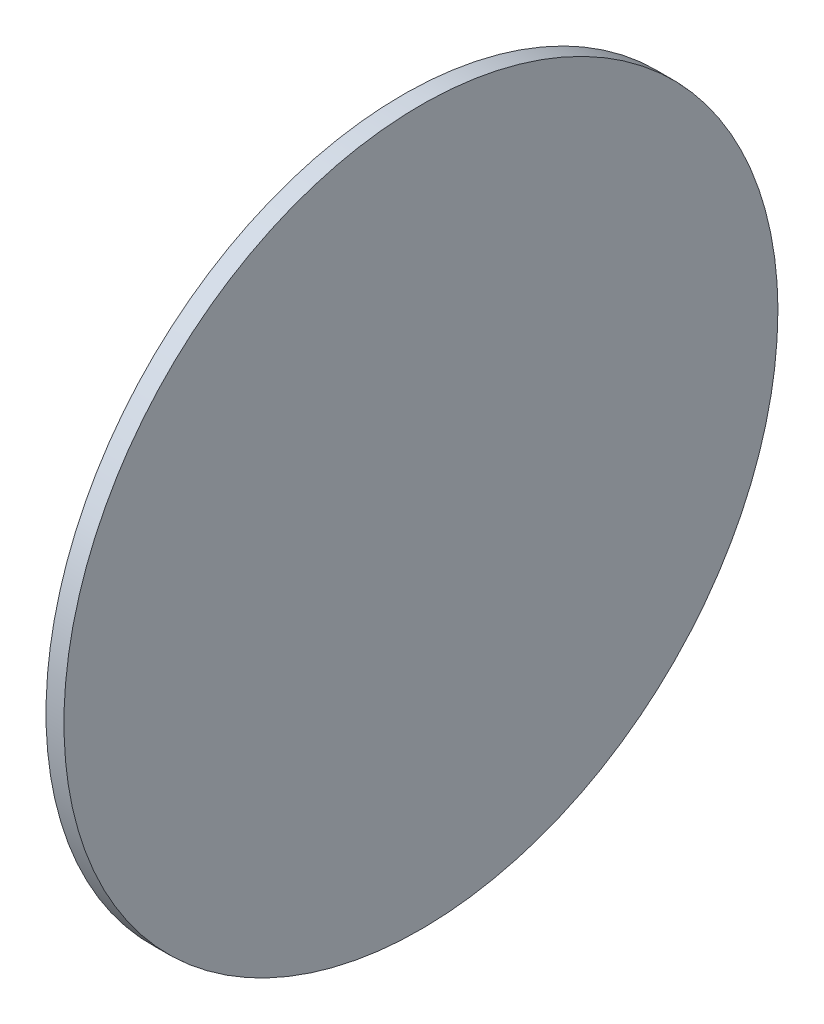
ISO-10303-21;
HEADER;
FILE_DESCRIPTION(('STEP AP214'),'2;1');
FILE_NAME('part.step','',(''),(''),'','','');
FILE_SCHEMA(('AUTOMOTIVE_DESIGN { 1 0 10303 214 1 1 1 1 }'));
ENDSEC;
DATA;
#1=APPLICATION_CONTEXT('core data for automotive mechanical design processes');
#2=APPLICATION_PROTOCOL_DEFINITION('international standard','automotive_design',2000,#1);
#3=PRODUCT_CONTEXT('',#1,'mechanical');
#4=PRODUCT('Part','Part','',(#3));
#5=PRODUCT_RELATED_PRODUCT_CATEGORY('part','',(#4));
#6=PRODUCT_DEFINITION_FORMATION('','',#4);
#7=PRODUCT_DEFINITION_CONTEXT('part definition',#1,'design');
#8=PRODUCT_DEFINITION('design','',#6,#7);
#9=PRODUCT_DEFINITION_SHAPE('','',#8);
#10=(LENGTH_UNIT() NAMED_UNIT(*) SI_UNIT(.MILLI.,.METRE.));
#11=(NAMED_UNIT(*) PLANE_ANGLE_UNIT() SI_UNIT($,.RADIAN.));
#12=(NAMED_UNIT(*) SI_UNIT($,.STERADIAN.) SOLID_ANGLE_UNIT());
#13=UNCERTAINTY_MEASURE_WITH_UNIT(LENGTH_MEASURE(1.E-05),#10,'distance_accuracy_value','');
#14=(GEOMETRIC_REPRESENTATION_CONTEXT(3) GLOBAL_UNCERTAINTY_ASSIGNED_CONTEXT((#13)) GLOBAL_UNIT_ASSIGNED_CONTEXT((#10,
#11,#12)) REPRESENTATION_CONTEXT('',''));
#15=CARTESIAN_POINT('',(0.,0.,0.));
#16=DIRECTION('',(0.,0.,1.));
#17=DIRECTION('',(1.,0.,0.));
#18=AXIS2_PLACEMENT_3D('',#15,#16,#17);
#19=CARTESIAN_POINT('',(453.240366113346,276.116733993281,-130.857064009928));
#20=CARTESIAN_POINT('',(453.240366113346,278.977027062807,-130.857064009928));
#21=CARTESIAN_POINT('',(453.240366113346,284.697613201859,-130.576029634082));
#22=CARTESIAN_POINT('',(453.240366113346,293.195853852873,-129.315434714775));
#23=CARTESIAN_POINT('',(453.240366113346,301.529613243243,-127.227936658116));
#24=CARTESIAN_POINT('',(453.240366113346,309.618632714343,-124.333639211531));
#25=CARTESIAN_POINT('',(453.240366113346,317.385010586758,-120.660416041617));
#26=CARTESIAN_POINT('',(453.240366113346,324.753952396043,-116.243642295488));
#27=CARTESIAN_POINT('',(453.240366113346,331.654491204301,-111.125853918771));
#28=CARTESIAN_POINT('',(453.240366113346,338.020171050591,-105.356338011204));
#29=CARTESIAN_POINT('',(453.240366113346,343.789686958158,-98.9906581649144));
#30=CARTESIAN_POINT('',(453.240366113346,348.907475334874,-92.090119356656));
#31=CARTESIAN_POINT('',(453.240366113346,353.324249081004,-84.7211775473709));
#32=CARTESIAN_POINT('',(453.240366113346,356.997472250918,-76.9547996749559));
#33=CARTESIAN_POINT('',(453.240366113346,359.891769697502,-68.8657802038563));
#34=CARTESIAN_POINT('',(453.240366113346,361.979267754162,-60.5320208134866));
#35=CARTESIAN_POINT('',(453.240366113346,363.239862673468,-52.0337801624725));
#36=CARTESIAN_POINT('',(453.240366113346,363.661414237238,-43.452900953894));
#37=CARTESIAN_POINT('',(453.240366113346,363.239862673468,-34.8720217453155));
#38=CARTESIAN_POINT('',(453.240366113346,361.979267754162,-26.3737810943013));
#39=CARTESIAN_POINT('',(453.240366113346,359.891769697502,-18.0400217039317));
#40=CARTESIAN_POINT('',(453.240366113346,356.997472250918,-9.951002232832));
#41=CARTESIAN_POINT('',(453.240366113346,353.324249081004,-2.18462436041703));
#42=CARTESIAN_POINT('',(453.240366113346,348.907475334874,5.1843174488681));
#43=CARTESIAN_POINT('',(453.240366113346,343.789686958158,12.0848562571265));
#44=CARTESIAN_POINT('',(453.240366113346,338.020171050591,18.4505361034164));
#45=CARTESIAN_POINT('',(453.240366113346,331.654491204301,24.2200520109835));
#46=CARTESIAN_POINT('',(453.240366113346,324.753952396043,29.3378403876997));
#47=CARTESIAN_POINT('',(453.240366113346,317.385010586758,33.7546141338295));
#48=CARTESIAN_POINT('',(453.240366113346,309.618632714343,37.4278373037436));
#49=CARTESIAN_POINT('',(453.240366113346,301.529613243243,40.3221347503276));
#50=CARTESIAN_POINT('',(453.240366113346,293.195853852873,42.4096328069871));
#51=CARTESIAN_POINT('',(453.240366113346,284.697613201859,43.6702277262938));
#52=CARTESIAN_POINT('',(453.240366113346,276.116733993281,44.0917792900636));
#53=CARTESIAN_POINT('',(453.240366113346,267.535854784702,43.6702277262938));
#54=CARTESIAN_POINT('',(453.240366113346,259.037614133688,42.4096328069871));
#55=CARTESIAN_POINT('',(453.240366113346,250.703854743318,40.3221347503276));
#56=CARTESIAN_POINT('',(453.240366113346,242.614835272219,37.4278373037436));
#57=CARTESIAN_POINT('',(453.240366113346,234.848457399804,33.7546141338295));
#58=CARTESIAN_POINT('',(453.240366113346,227.479515590519,29.3378403876997));
#59=CARTESIAN_POINT('',(453.240366113346,220.57897678226,24.2200520109835));
#60=CARTESIAN_POINT('',(453.240366113346,214.21329693597,18.4505361034164));
#61=CARTESIAN_POINT('',(453.240366113346,208.443781028403,12.0848562571265));
#62=CARTESIAN_POINT('',(453.240366113346,203.325992651687,5.18431744886809));
#63=CARTESIAN_POINT('',(453.240366113346,198.909218905557,-2.18462436041694));
#64=CARTESIAN_POINT('',(453.240366113346,195.235995735643,-9.95100223283197));
#65=CARTESIAN_POINT('',(453.240366113346,192.341698289059,-18.0400217039316));
#66=CARTESIAN_POINT('',(453.240366113346,190.2542002324,-26.3737810943013));
#67=CARTESIAN_POINT('',(453.240366113346,188.993605313093,-34.8720217453154));
#68=CARTESIAN_POINT('',(453.240366113346,188.572053749323,-43.452900953894));
#69=CARTESIAN_POINT('',(453.240366113346,188.993605313093,-52.0337801624724));
#70=CARTESIAN_POINT('',(453.240366113346,190.2542002324,-60.5320208134866));
#71=CARTESIAN_POINT('',(453.240366113346,192.341698289059,-68.8657802038562));
#72=CARTESIAN_POINT('',(453.240366113346,195.235995735643,-76.9547996749559));
#73=CARTESIAN_POINT('',(453.240366113346,198.909218905557,-84.7211775473709));
#74=CARTESIAN_POINT('',(453.240366113346,203.325992651687,-92.090119356656));
#75=CARTESIAN_POINT('',(453.240366113346,208.443781028403,-98.9906581649144));
#76=CARTESIAN_POINT('',(453.240366113346,214.21329693597,-105.356338011204));
#77=CARTESIAN_POINT('',(453.240366113346,220.57897678226,-111.125853918771));
#78=CARTESIAN_POINT('',(453.240366113346,227.479515590519,-116.243642295488));
#79=CARTESIAN_POINT('',(453.240366113346,234.848457399804,-120.660416041617));
#80=CARTESIAN_POINT('',(453.240366113346,242.614835272219,-124.333639211531));
#81=CARTESIAN_POINT('',(453.240366113346,250.703854743318,-127.227936658116));
#82=CARTESIAN_POINT('',(453.240366113346,259.037614133688,-129.315434714775));
#83=CARTESIAN_POINT('',(453.240366113346,267.535854784702,-130.576029634082));
#84=CARTESIAN_POINT('',(453.240366113346,273.256440923754,-130.857064009928));
#85=CARTESIAN_POINT('',(453.240366113346,276.116733993281,-130.857064009928));
#86=B_SPLINE_CURVE_WITH_KNOTS('',3,(#19,#20,#21,#22,#23,#24,#25,#26,#27,#28,#29,#30,#31,#32,#33,
#34,#35,#36,#37,#38,#39,#40,#41,#42,#43,#44,#45,#46,#47,#48,#49,#50,#51,#52,#53,#54,#55,#56,#57,
#58,#59,#60,#61,#62,#63,#64,#65,#66,#67,#68,#69,#70,#71,#72,#73,#74,#75,#76,#77,#78,#79,#80,#81,
#82,#83,#84,#85),.UNSPECIFIED.,.T.,.F.,(4,1,1,1,1,1,1,1,1,1,1,1,1,1,1,1,1,1,1,1,1,1,1,1,1,1,1,1,
1,1,1,1,1,1,1,1,1,1,1,1,1,1,1,1,1,1,1,1,1,1,1,1,1,1,1,1,1,1,1,1,1,1,1,1,4),(0.,0.015625,
0.0312499999999999,0.046875,0.0625,0.0781249999999999,0.0937499999999999,0.109375,0.125,
0.140625,0.15625,0.171875,0.1875,0.203125,0.21875,0.234375,0.25,0.265625,0.28125,0.296875,
0.3125,0.328125,0.34375,0.359375,0.375,0.390625,0.40625,0.421875,0.4375,0.453125,0.46875,
0.484375,0.5,0.515625,0.53125,0.546875,0.5625,0.578125,0.59375,0.609375,0.625,0.640625,0.65625,
0.671875,0.6875,0.703125,0.71875,0.734375,0.75,0.765625,0.78125,0.796875,0.8125,0.828125,
0.84375,0.859375,0.875,0.890625,0.90625,0.921875,0.9375,0.953125,0.96875,0.984375,1.),.UNSPECIFIED.);
#87=DIRECTION('',(1.,0.,0.));
#88=VECTOR('',#87,1.);
#89=SURFACE_OF_LINEAR_EXTRUSION('',#86,#88);
#90=CARTESIAN_POINT('',(453.240366113346,276.116733993281,-130.857064009928));
#91=CARTESIAN_POINT('',(453.240366113346,278.977027062807,-130.857064009928));
#92=CARTESIAN_POINT('',(453.240366113346,284.697613201859,-130.576029634082));
#93=CARTESIAN_POINT('',(453.240366113346,293.195853852873,-129.315434714775));
#94=CARTESIAN_POINT('',(453.240366113346,301.529613243243,-127.227936658116));
#95=CARTESIAN_POINT('',(453.240366113346,309.618632714343,-124.333639211531));
#96=CARTESIAN_POINT('',(453.240366113346,317.385010586758,-120.660416041617));
#97=CARTESIAN_POINT('',(453.240366113346,324.753952396043,-116.243642295488));
#98=CARTESIAN_POINT('',(453.240366113346,331.654491204301,-111.125853918771));
#99=CARTESIAN_POINT('',(453.240366113346,338.020171050591,-105.356338011204));
#100=CARTESIAN_POINT('',(453.240366113346,343.789686958158,-98.9906581649144));
#101=CARTESIAN_POINT('',(453.240366113346,348.907475334874,-92.090119356656));
#102=CARTESIAN_POINT('',(453.240366113346,353.324249081004,-84.7211775473709));
#103=CARTESIAN_POINT('',(453.240366113346,356.997472250918,-76.9547996749559));
#104=CARTESIAN_POINT('',(453.240366113346,359.891769697502,-68.8657802038563));
#105=CARTESIAN_POINT('',(453.240366113346,361.979267754162,-60.5320208134866));
#106=CARTESIAN_POINT('',(453.240366113346,363.239862673468,-52.0337801624725));
#107=CARTESIAN_POINT('',(453.240366113346,363.661414237238,-43.452900953894));
#108=CARTESIAN_POINT('',(453.240366113346,363.239862673468,-34.8720217453155));
#109=CARTESIAN_POINT('',(453.240366113346,361.979267754162,-26.3737810943013));
#110=CARTESIAN_POINT('',(453.240366113346,359.891769697502,-18.0400217039317));
#111=CARTESIAN_POINT('',(453.240366113346,356.997472250918,-9.951002232832));
#112=CARTESIAN_POINT('',(453.240366113346,353.324249081004,-2.18462436041703));
#113=CARTESIAN_POINT('',(453.240366113346,348.907475334874,5.1843174488681));
#114=CARTESIAN_POINT('',(453.240366113346,343.789686958158,12.0848562571265));
#115=CARTESIAN_POINT('',(453.240366113346,338.020171050591,18.4505361034164));
#116=CARTESIAN_POINT('',(453.240366113346,331.654491204301,24.2200520109835));
#117=CARTESIAN_POINT('',(453.240366113346,324.753952396043,29.3378403876997));
#118=CARTESIAN_POINT('',(453.240366113346,317.385010586758,33.7546141338295));
#119=CARTESIAN_POINT('',(453.240366113346,309.618632714343,37.4278373037436));
#120=CARTESIAN_POINT('',(453.240366113346,301.529613243243,40.3221347503276));
#121=CARTESIAN_POINT('',(453.240366113346,293.195853852873,42.4096328069871));
#122=CARTESIAN_POINT('',(453.240366113346,284.697613201859,43.6702277262938));
#123=CARTESIAN_POINT('',(453.240366113346,276.116733993281,44.0917792900636));
#124=CARTESIAN_POINT('',(453.240366113346,267.535854784702,43.6702277262938));
#125=CARTESIAN_POINT('',(453.240366113346,259.037614133688,42.4096328069871));
#126=CARTESIAN_POINT('',(453.240366113346,250.703854743318,40.3221347503276));
#127=CARTESIAN_POINT('',(453.240366113346,242.614835272219,37.4278373037436));
#128=CARTESIAN_POINT('',(453.240366113346,234.848457399804,33.7546141338295));
#129=CARTESIAN_POINT('',(453.240366113346,227.479515590519,29.3378403876997));
#130=CARTESIAN_POINT('',(453.240366113346,220.57897678226,24.2200520109835));
#131=CARTESIAN_POINT('',(453.240366113346,214.21329693597,18.4505361034164));
#132=CARTESIAN_POINT('',(453.240366113346,208.443781028403,12.0848562571265));
#133=CARTESIAN_POINT('',(453.240366113346,203.325992651687,5.18431744886809));
#134=CARTESIAN_POINT('',(453.240366113346,198.909218905557,-2.18462436041694));
#135=CARTESIAN_POINT('',(453.240366113346,195.235995735643,-9.95100223283197));
#136=CARTESIAN_POINT('',(453.240366113346,192.341698289059,-18.0400217039316));
#137=CARTESIAN_POINT('',(453.240366113346,190.2542002324,-26.3737810943013));
#138=CARTESIAN_POINT('',(453.240366113346,188.993605313093,-34.8720217453154));
#139=CARTESIAN_POINT('',(453.240366113346,188.572053749323,-43.452900953894));
#140=CARTESIAN_POINT('',(453.240366113346,188.993605313093,-52.0337801624724));
#141=CARTESIAN_POINT('',(453.240366113346,190.2542002324,-60.5320208134866));
#142=CARTESIAN_POINT('',(453.240366113346,192.341698289059,-68.8657802038562));
#143=CARTESIAN_POINT('',(453.240366113346,195.235995735643,-76.9547996749559));
#144=CARTESIAN_POINT('',(453.240366113346,198.909218905557,-84.7211775473709));
#145=CARTESIAN_POINT('',(453.240366113346,203.325992651687,-92.090119356656));
#146=CARTESIAN_POINT('',(453.240366113346,208.443781028403,-98.9906581649144));
#147=CARTESIAN_POINT('',(453.240366113346,214.21329693597,-105.356338011204));
#148=CARTESIAN_POINT('',(453.240366113346,220.57897678226,-111.125853918771));
#149=CARTESIAN_POINT('',(453.240366113346,227.479515590519,-116.243642295488));
#150=CARTESIAN_POINT('',(453.240366113346,234.848457399804,-120.660416041617));
#151=CARTESIAN_POINT('',(453.240366113346,242.614835272219,-124.333639211531));
#152=CARTESIAN_POINT('',(453.240366113346,250.703854743318,-127.227936658116));
#153=CARTESIAN_POINT('',(453.240366113346,259.037614133688,-129.315434714775));
#154=CARTESIAN_POINT('',(453.240366113346,267.535854784702,-130.576029634082));
#155=CARTESIAN_POINT('',(453.240366113346,273.256440923754,-130.857064009928));
#156=CARTESIAN_POINT('',(453.240366113346,276.116733993281,-130.857064009928));
#157=B_SPLINE_CURVE_WITH_KNOTS('',3,(#90,#91,#92,#93,#94,#95,#96,#97,#98,#99,#100,#101,#102,
#103,#104,#105,#106,#107,#108,#109,#110,#111,#112,#113,#114,#115,#116,#117,#118,#119,#120,#121,
#122,#123,#124,#125,#126,#127,#128,#129,#130,#131,#132,#133,#134,#135,#136,#137,#138,#139,#140,
#141,#142,#143,#144,#145,#146,#147,#148,#149,#150,#151,#152,#153,#154,#155,#156),.UNSPECIFIED.,
.T.,.F.,(4,1,1,1,1,1,1,1,1,1,1,1,1,1,1,1,1,1,1,1,1,1,1,1,1,1,1,1,1,1,1,1,1,1,1,1,1,1,1,1,1,1,1,
1,1,1,1,1,1,1,1,1,1,1,1,1,1,1,1,1,1,1,1,1,4),(0.,0.015625,0.0312499999999999,0.046875,0.0625,
0.0781249999999999,0.0937499999999999,0.109375,0.125,0.140625,0.15625,0.171875,0.1875,0.203125,
0.21875,0.234375,0.25,0.265625,0.28125,0.296875,0.3125,0.328125,0.34375,0.359375,0.375,0.390625,
0.40625,0.421875,0.4375,0.453125,0.46875,0.484375,0.5,0.515625,0.53125,0.546875,0.5625,0.578125,
0.59375,0.609375,0.625,0.640625,0.65625,0.671875,0.6875,0.703125,0.71875,0.734375,0.75,0.765625,
0.78125,0.796875,0.8125,0.828125,0.84375,0.859375,0.875,0.890625,0.90625,0.921875,0.9375,
0.953125,0.96875,0.984375,1.),.UNSPECIFIED.);
#158=CARTESIAN_POINT('',(453.240366113346,276.116733993281,-130.857064009928));
#159=VERTEX_POINT('',#158);
#160=EDGE_CURVE('E9',#159,#159,#157,.T.);
#161=ORIENTED_EDGE('',*,*,#160,.T.);
#162=EDGE_LOOP('',(#161));
#163=FACE_BOUND('',#162,.T.);
#164=CARTESIAN_POINT('',(457.634741800947,276.116733993281,-130.857064009928));
#165=CARTESIAN_POINT('',(457.634741800947,274.686587458518,-130.857064009928));
#166=CARTESIAN_POINT('',(457.634741800947,273.256440923754,-130.821934712947));
#167=CARTESIAN_POINT('',(457.634741800947,270.39959112746,-130.681586682191));
#168=CARTESIAN_POINT('',(457.634741800947,268.972887865929,-130.576367948415));
#169=CARTESIAN_POINT('',(457.634741800947,266.12636788933,-130.296010201236));
#170=CARTESIAN_POINT('',(457.634741800947,264.706551174263,-130.120871187832));
#171=CARTESIAN_POINT('',(457.634741800947,261.87721440322,-129.701178723821));
#172=CARTESIAN_POINT('',(457.634741800947,260.467694347244,-129.456625273213));
#173=CARTESIAN_POINT('',(457.634741800947,257.662361007013,-128.898609777219));
#174=CARTESIAN_POINT('',(457.634741800947,256.266547722758,-128.585147731832));
#175=CARTESIAN_POINT('',(457.634741800947,253.491972036744,-127.890152702422));
#176=CARTESIAN_POINT('',(457.634741800947,252.113209634986,-127.508619718398));
#177=CARTESIAN_POINT('',(457.634741800947,249.376079824741,-126.678320467858));
#178=CARTESIAN_POINT('',(457.634741800947,248.017712416255,-126.229554201341));
#179=CARTESIAN_POINT('',(457.634741800947,245.324618495864,-125.265949788587));
#180=CARTESIAN_POINT('',(457.634741800947,243.989891983959,-124.751111642351));
#181=CARTESIAN_POINT('',(457.634741800947,241.34732576004,-123.656524872935));
#182=CARTESIAN_POINT('',(457.634741800947,240.039486048026,-123.076776249755));
#183=CARTESIAN_POINT('',(457.634741800947,237.453809859906,-121.853842490913));
#184=CARTESIAN_POINT('',(457.634741800947,236.1759733838,-121.210657355252));
#185=CARTESIAN_POINT('',(457.634741800947,233.653420103517,-119.862324535911));
#186=CARTESIAN_POINT('',(457.634741800947,232.408703299339,-119.157176852232));
#187=CARTESIAN_POINT('',(457.634741800947,229.955346318656,-117.686691267923));
#188=CARTESIAN_POINT('',(457.634741800947,228.746706142152,-116.921353367294));
#189=CARTESIAN_POINT('',(457.634741800947,226.368459372561,-115.332259680153));
#190=CARTESIAN_POINT('',(457.634741800947,225.198852779475,-114.508503893641));
#191=CARTESIAN_POINT('',(457.634741800947,222.901442175095,-112.804628063891));
#192=CARTESIAN_POINT('',(457.634741800947,221.773638163801,-111.924508020653));
#193=CARTESIAN_POINT('',(457.634741800947,219.562601721376,-110.109957306606));
#194=CARTESIAN_POINT('',(457.634741800947,218.479369290246,-109.175526635797));
#195=CARTESIAN_POINT('',(457.634741800947,216.36003038218,-107.25466981628));
#196=CARTESIAN_POINT('',(457.634741800947,215.323923905246,-106.268243667572));
#197=CARTESIAN_POINT('',(457.634741800947,213.301391279603,-104.245711041929));
#198=CARTESIAN_POINT('',(457.634741800947,212.314965130895,-103.209604564994));
#199=CARTESIAN_POINT('',(457.634741800947,210.394108311378,-101.090265656929));
#200=CARTESIAN_POINT('',(457.634741800947,209.459677640569,-100.007033225799));
#201=CARTESIAN_POINT('',(457.634741800947,207.645126926521,-97.795996783374));
#202=CARTESIAN_POINT('',(457.634741800947,206.765006883283,-96.6681927720796));
#203=CARTESIAN_POINT('',(457.634741800947,205.061131053534,-94.3707821676994));
#204=CARTESIAN_POINT('',(457.634741800947,204.237375267022,-93.2011755746136));
#205=CARTESIAN_POINT('',(457.634741800947,202.648281579881,-90.822928805023));
#206=CARTESIAN_POINT('',(457.634741800947,201.882943679252,-89.6142886285182));
#207=CARTESIAN_POINT('',(457.634741800947,200.412458094943,-87.1609316478356));
#208=CARTESIAN_POINT('',(457.634741800947,199.707310411264,-85.9162148436576));
#209=CARTESIAN_POINT('',(457.634741800947,198.358977591923,-83.3936615633743));
#210=CARTESIAN_POINT('',(457.634741800947,197.715792456262,-82.1158250872689));
#211=CARTESIAN_POINT('',(457.634741800947,196.49285869742,-79.5301488991491));
#212=CARTESIAN_POINT('',(457.634741800947,195.91311007424,-78.2223091871347));
#213=CARTESIAN_POINT('',(457.634741800947,194.818523304823,-75.5797429632156));
#214=CARTESIAN_POINT('',(457.634741800947,194.303685158587,-74.2450164513109));
#215=CARTESIAN_POINT('',(457.634741800947,193.340080745834,-71.5519225309199));
#216=CARTESIAN_POINT('',(457.634741800947,192.891314479317,-70.1935551224338));
#217=CARTESIAN_POINT('',(457.634741800947,192.061015228776,-67.4564253121889));
#218=CARTESIAN_POINT('',(457.634741800947,191.679482244753,-66.0776629104302));
#219=CARTESIAN_POINT('',(457.634741800947,190.984487215343,-63.3030872244164));
#220=CARTESIAN_POINT('',(457.634741800947,190.671025169956,-61.9072739401612));
#221=CARTESIAN_POINT('',(457.634741800947,190.113009673961,-59.1019405999306));
#222=CARTESIAN_POINT('',(457.634741800947,189.868456223354,-57.6924205439551));
#223=CARTESIAN_POINT('',(457.634741800947,189.448763759343,-54.8630837729121));
#224=CARTESIAN_POINT('',(457.634741800947,189.273624745939,-53.4432670578445));
#225=CARTESIAN_POINT('',(457.634741800947,188.993266998759,-50.5967470812458));
#226=CARTESIAN_POINT('',(457.634741800947,188.888048264984,-49.1700438197145));
#227=CARTESIAN_POINT('',(457.634741800947,188.747700234227,-46.3131940234202));
#228=CARTESIAN_POINT('',(457.634741800947,188.712570937246,-44.8830474886571));
#229=CARTESIAN_POINT('',(457.634741800947,188.712570937246,-42.022754419131));
#230=CARTESIAN_POINT('',(457.634741800947,188.747700234227,-40.5926078843679));
#231=CARTESIAN_POINT('',(457.634741800947,188.888048264984,-37.7357580880736));
#232=CARTESIAN_POINT('',(457.634741800947,188.993266998759,-36.3090548265423));
#233=CARTESIAN_POINT('',(457.634741800947,189.273624745939,-33.4625348499435));
#234=CARTESIAN_POINT('',(457.634741800947,189.448763759343,-32.042718134876));
#235=CARTESIAN_POINT('',(457.634741800947,189.868456223354,-29.2133813638329));
#236=CARTESIAN_POINT('',(457.634741800947,190.113009673961,-27.8038613078574));
#237=CARTESIAN_POINT('',(457.634741800947,190.671025169956,-24.9985279676268));
#238=CARTESIAN_POINT('',(457.634741800947,190.984487215343,-23.6027146833717));
#239=CARTESIAN_POINT('',(457.634741800947,191.679482244753,-20.8281389973579));
#240=CARTESIAN_POINT('',(457.634741800947,192.061015228776,-19.4493765955992));
#241=CARTESIAN_POINT('',(457.634741800947,192.891314479317,-16.7122467853543));
#242=CARTESIAN_POINT('',(457.634741800947,193.340080745834,-15.3538793768681));
#243=CARTESIAN_POINT('',(457.634741800947,194.303685158587,-12.6607854564772));
#244=CARTESIAN_POINT('',(457.634741800947,194.818523304823,-11.3260589445724));
#245=CARTESIAN_POINT('',(457.634741800947,195.91311007424,-8.68349272065329));
#246=CARTESIAN_POINT('',(457.634741800947,196.49285869742,-7.37565300863891));
#247=CARTESIAN_POINT('',(457.634741800947,197.715792456261,-4.78997682051912));
#248=CARTESIAN_POINT('',(457.634741800947,198.358977591923,-3.51214034441369));
#249=CARTESIAN_POINT('',(457.634741800947,199.707310411264,-0.989587064130344));
#250=CARTESIAN_POINT('',(457.634741800947,200.412458094943,0.255129740047586));
#251=CARTESIAN_POINT('',(457.634741800947,201.882943679251,2.70848672073024));
#252=CARTESIAN_POINT('',(457.634741800947,202.648281579881,3.91712689723497));
#253=CARTESIAN_POINT('',(457.634741800947,204.237375267022,6.29537366682554));
#254=CARTESIAN_POINT('',(457.634741800947,205.061131053534,7.46498025991138));
#255=CARTESIAN_POINT('',(457.634741800947,206.765006883283,9.7623908642916));
#256=CARTESIAN_POINT('',(457.634741800947,207.645126926521,10.890194875586));
#257=CARTESIAN_POINT('',(457.634741800947,209.459677640569,13.1012313180107));
#258=CARTESIAN_POINT('',(457.634741800947,210.394108311378,14.184463749141));
#259=CARTESIAN_POINT('',(457.634741800947,212.314965130895,16.3038026572062));
#260=CARTESIAN_POINT('',(457.634741800947,213.301391279603,17.3399091341411));
#261=CARTESIAN_POINT('',(457.634741800947,215.323923905245,19.3624417597839));
#262=CARTESIAN_POINT('',(457.634741800948,216.36003038218,20.3488679084919));
#263=CARTESIAN_POINT('',(457.634741800948,218.479369290246,22.2697247280089));
#264=CARTESIAN_POINT('',(457.634741800948,219.562601721376,23.204155398818));
#265=CARTESIAN_POINT('',(457.634741800948,221.773638163801,25.0187061128652));
#266=CARTESIAN_POINT('',(457.634741800948,222.901442175095,25.8988261561034));
#267=CARTESIAN_POINT('',(457.634741800948,225.198852779475,27.6027019858531));
#268=CARTESIAN_POINT('',(457.634741800947,226.368459372561,28.4264577723648));
#269=CARTESIAN_POINT('',(457.634741800947,228.746706142152,30.0155514595058));
#270=CARTESIAN_POINT('',(457.634741800948,229.955346318656,30.7808893601352));
#271=CARTESIAN_POINT('',(457.634741800948,232.408703299339,32.2513749444439));
#272=CARTESIAN_POINT('',(457.634741800947,233.653420103517,32.9565226281232));
#273=CARTESIAN_POINT('',(457.634741800947,236.1759733838,34.3048554474638));
#274=CARTESIAN_POINT('',(457.634741800948,237.453809859906,34.9480405831252));
#275=CARTESIAN_POINT('',(457.634741800948,240.039486048026,36.1709743419668));
#276=CARTESIAN_POINT('',(457.634741800948,241.34732576004,36.750722965147));
#277=CARTESIAN_POINT('',(457.634741800947,243.989891983959,37.8453097345634));
#278=CARTESIAN_POINT('',(457.634741800947,245.324618495864,38.3601478807995));
#279=CARTESIAN_POINT('',(457.634741800947,248.017712416255,39.3237522935527));
#280=CARTESIAN_POINT('',(457.634741800947,249.376079824741,39.7725185600699));
#281=CARTESIAN_POINT('',(457.634741800947,252.113209634986,40.6028178106105));
#282=CARTESIAN_POINT('',(457.634741800947,253.491972036744,40.9843507946339));
#283=CARTESIAN_POINT('',(457.634741800947,256.266547722758,41.6793458240442));
#284=CARTESIAN_POINT('',(457.634741800947,257.662361007013,41.9928078694311));
#285=CARTESIAN_POINT('',(457.634741800947,260.467694347244,42.5508233654255));
#286=CARTESIAN_POINT('',(457.634741800947,261.877214403219,42.7953768160329));
#287=CARTESIAN_POINT('',(457.634741800947,264.706551174262,43.2150692800442));
#288=CARTESIAN_POINT('',(457.634741800947,266.12636788933,43.3902082934479));
#289=CARTESIAN_POINT('',(457.634741800947,268.972887865929,43.6705660406273));
#290=CARTESIAN_POINT('',(457.634741800947,270.39959112746,43.775784774403));
#291=CARTESIAN_POINT('',(457.634741800947,273.256440923754,43.9161328051595));
#292=CARTESIAN_POINT('',(457.634741800947,274.686587458517,43.9512621021403));
#293=CARTESIAN_POINT('',(457.634741800947,277.546880528044,43.9512621021403));
#294=CARTESIAN_POINT('',(457.634741800947,278.977027062807,43.9161328051595));
#295=CARTESIAN_POINT('',(457.634741800947,281.833876859101,43.775784774403));
#296=CARTESIAN_POINT('',(457.634741800948,283.260580120632,43.6705660406274));
#297=CARTESIAN_POINT('',(457.634741800948,286.107100097231,43.390208293448));
#298=CARTESIAN_POINT('',(457.634741800948,287.526916812299,43.2150692800442));
#299=CARTESIAN_POINT('',(457.634741800947,290.356253583342,42.795376816033));
#300=CARTESIAN_POINT('',(457.634741800947,291.765773639317,42.5508233654255));
#301=CARTESIAN_POINT('',(457.634741800947,294.571106979548,41.9928078694312));
#302=CARTESIAN_POINT('',(457.634741800947,295.966920263803,41.6793458240443));
#303=CARTESIAN_POINT('',(457.634741800947,298.741495949817,40.984350794634));
#304=CARTESIAN_POINT('',(457.634741800947,300.120258351575,40.6028178106105));
#305=CARTESIAN_POINT('',(457.634741800947,302.85738816182,39.77251856007));
#306=CARTESIAN_POINT('',(457.634741800947,304.215755570306,39.3237522935528));
#307=CARTESIAN_POINT('',(457.634741800947,306.908849490697,38.3601478807996));
#308=CARTESIAN_POINT('',(457.634741800947,308.243576002602,37.8453097345635));
#309=CARTESIAN_POINT('',(457.634741800947,310.886142226521,36.7507229651471));
#310=CARTESIAN_POINT('',(457.634741800947,312.193981938536,36.1709743419669));
#311=CARTESIAN_POINT('',(457.634741800947,314.779658126655,34.9480405831253));
#312=CARTESIAN_POINT('',(457.634741800947,316.057494602761,34.304855447464));
#313=CARTESIAN_POINT('',(457.634741800947,318.580047883044,32.9565226281233));
#314=CARTESIAN_POINT('',(457.634741800947,319.824764687222,32.251374944444));
#315=CARTESIAN_POINT('',(457.634741800947,322.278121667905,30.7808893601353));
#316=CARTESIAN_POINT('',(457.634741800947,323.48676184441,30.0155514595059));
#317=CARTESIAN_POINT('',(457.634741800947,325.865008614,28.4264577723649));
#318=CARTESIAN_POINT('',(457.634741800947,327.034615207086,27.6027019858533));
#319=CARTESIAN_POINT('',(457.634741800947,329.332025811466,25.8988261561035));
#320=CARTESIAN_POINT('',(457.634741800947,330.459829822761,25.0187061128653));
#321=CARTESIAN_POINT('',(457.634741800947,332.670866265185,23.2041553988181));
#322=CARTESIAN_POINT('',(457.634741800947,333.754098696316,22.2697247280091));
#323=CARTESIAN_POINT('',(457.634741800947,335.873437604381,20.3488679084921));
#324=CARTESIAN_POINT('',(457.634741800947,336.909544081316,19.3624417597841));
#325=CARTESIAN_POINT('',(457.634741800947,338.932076706959,17.3399091341412));
#326=CARTESIAN_POINT('',(457.634741800947,339.918502855666,16.3038026572064));
#327=CARTESIAN_POINT('',(457.634741800947,341.839359675184,14.1844637491412));
#328=CARTESIAN_POINT('',(457.634741800947,342.773790345993,13.1012313180108));
#329=CARTESIAN_POINT('',(457.634741800947,344.58834106004,10.8901948755861));
#330=CARTESIAN_POINT('',(457.634741800947,345.468461103278,9.76239086429173));
#331=CARTESIAN_POINT('',(457.634741800947,347.172336933028,7.46498025991151));
#332=CARTESIAN_POINT('',(457.634741800947,347.996092719539,6.29537366682568));
#333=CARTESIAN_POINT('',(457.634741800947,349.585186406681,3.91712689723511));
#334=CARTESIAN_POINT('',(457.634741800947,350.35052430731,2.70848672073036));
#335=CARTESIAN_POINT('',(457.634741800947,351.821009891619,0.255129740047687));
#336=CARTESIAN_POINT('',(457.634741800948,352.526157575298,-0.989587064130239));
#337=CARTESIAN_POINT('',(457.634741800948,353.874490394639,-3.51214034441359));
#338=CARTESIAN_POINT('',(457.634741800948,354.5176755303,-4.78997682051902));
#339=CARTESIAN_POINT('',(457.634741800948,355.740609289141,-7.37565300863881));
#340=CARTESIAN_POINT('',(457.634741800947,356.320357912322,-8.68349272065316));
#341=CARTESIAN_POINT('',(457.634741800947,357.414944681738,-11.3260589445723));
#342=CARTESIAN_POINT('',(457.634741800947,357.929782827974,-12.660785456477));
#343=CARTESIAN_POINT('',(457.634741800947,358.893387240727,-15.3538793768679));
#344=CARTESIAN_POINT('',(457.634741800947,359.342153507245,-16.7122467853541));
#345=CARTESIAN_POINT('',(457.634741800947,360.172452757785,-19.449376595599));
#346=CARTESIAN_POINT('',(457.634741800947,360.553985741809,-20.8281389973577));
#347=CARTESIAN_POINT('',(457.634741800947,361.248980771219,-23.6027146833715));
#348=CARTESIAN_POINT('',(457.634741800947,361.562442816606,-24.9985279676267));
#349=CARTESIAN_POINT('',(457.634741800947,362.1204583126,-27.8038613078573));
#350=CARTESIAN_POINT('',(457.634741800947,362.365011763208,-29.2133813638328));
#351=CARTESIAN_POINT('',(457.634741800947,362.784704227219,-32.0427181348759));
#352=CARTESIAN_POINT('',(457.634741800947,362.959843240623,-33.4625348499434));
#353=CARTESIAN_POINT('',(457.634741800947,363.240200987802,-36.3090548265422));
#354=CARTESIAN_POINT('',(457.634741800947,363.345419721578,-37.7357580880734));
#355=CARTESIAN_POINT('',(457.634741800947,363.485767752334,-40.5926078843677));
#356=CARTESIAN_POINT('',(457.634741800947,363.520897049315,-42.0227544191308));
#357=CARTESIAN_POINT('',(457.634741800947,363.520897049315,-44.883047488657));
#358=CARTESIAN_POINT('',(457.634741800947,363.485767752334,-46.3131940234201));
#359=CARTESIAN_POINT('',(457.634741800948,363.345419721578,-49.1700438197144));
#360=CARTESIAN_POINT('',(457.634741800948,363.240200987802,-50.5967470812456));
#361=CARTESIAN_POINT('',(457.634741800948,362.959843240623,-53.4432670578444));
#362=CARTESIAN_POINT('',(457.634741800948,362.784704227219,-54.8630837729119));
#363=CARTESIAN_POINT('',(457.634741800948,362.365011763208,-57.692420543955));
#364=CARTESIAN_POINT('',(457.634741800948,362.1204583126,-59.1019405999305));
#365=CARTESIAN_POINT('',(457.634741800948,361.562442816606,-61.9072739401611));
#366=CARTESIAN_POINT('',(457.634741800948,361.248980771219,-63.3030872244163));
#367=CARTESIAN_POINT('',(457.634741800948,360.553985741809,-66.0776629104301));
#368=CARTESIAN_POINT('',(457.634741800948,360.172452757785,-67.4564253121888));
#369=CARTESIAN_POINT('',(457.634741800948,359.342153507245,-70.1935551224337));
#370=CARTESIAN_POINT('',(457.634741800948,358.893387240727,-71.5519225309199));
#371=CARTESIAN_POINT('',(457.634741800948,357.929782827974,-74.2450164513108));
#372=CARTESIAN_POINT('',(457.634741800947,357.414944681738,-75.5797429632155));
#373=CARTESIAN_POINT('',(457.634741800947,356.320357912322,-78.2223091871346));
#374=CARTESIAN_POINT('',(457.634741800947,355.740609289141,-79.530148899149));
#375=CARTESIAN_POINT('',(457.634741800947,354.5176755303,-82.1158250872688));
#376=CARTESIAN_POINT('',(457.634741800947,353.874490394639,-83.3936615633742));
#377=CARTESIAN_POINT('',(457.634741800947,352.526157575298,-85.9162148436576));
#378=CARTESIAN_POINT('',(457.634741800947,351.821009891619,-87.1609316478355));
#379=CARTESIAN_POINT('',(457.634741800947,350.35052430731,-89.6142886285182));
#380=CARTESIAN_POINT('',(457.634741800947,349.58518640668,-90.8229288050229));
#381=CARTESIAN_POINT('',(457.634741800947,347.996092719539,-93.2011755746135));
#382=CARTESIAN_POINT('',(457.634741800947,347.172336933028,-94.3707821676993));
#383=CARTESIAN_POINT('',(457.634741800947,345.468461103278,-96.6681927720795));
#384=CARTESIAN_POINT('',(457.634741800947,344.58834106004,-97.7959967833739));
#385=CARTESIAN_POINT('',(457.634741800947,342.773790345993,-100.007033225799));
#386=CARTESIAN_POINT('',(457.634741800947,341.839359675184,-101.090265656929));
#387=CARTESIAN_POINT('',(457.634741800947,339.918502855667,-103.209604564994));
#388=CARTESIAN_POINT('',(457.634741800947,338.932076706959,-104.245711041929));
#389=CARTESIAN_POINT('',(457.634741800947,336.909544081316,-106.268243667572));
#390=CARTESIAN_POINT('',(457.634741800947,335.873437604381,-107.25466981628));
#391=CARTESIAN_POINT('',(457.634741800947,333.754098696316,-109.175526635797));
#392=CARTESIAN_POINT('',(457.634741800947,332.670866265185,-110.109957306606));
#393=CARTESIAN_POINT('',(457.634741800947,330.459829822761,-111.924508020653));
#394=CARTESIAN_POINT('',(457.634741800947,329.332025811466,-112.804628063891));
#395=CARTESIAN_POINT('',(457.634741800947,327.034615207086,-114.508503893641));
#396=CARTESIAN_POINT('',(457.634741800947,325.865008614,-115.332259680153));
#397=CARTESIAN_POINT('',(457.634741800947,323.48676184441,-116.921353367294));
#398=CARTESIAN_POINT('',(457.634741800947,322.278121667905,-117.686691267923));
#399=CARTESIAN_POINT('',(457.634741800947,319.824764687222,-119.157176852232));
#400=CARTESIAN_POINT('',(457.634741800947,318.580047883044,-119.862324535911));
#401=CARTESIAN_POINT('',(457.634741800947,316.057494602761,-121.210657355252));
#402=CARTESIAN_POINT('',(457.634741800947,314.779658126656,-121.853842490913));
#403=CARTESIAN_POINT('',(457.634741800947,312.193981938536,-123.076776249755));
#404=CARTESIAN_POINT('',(457.634741800947,310.886142226521,-123.656524872935));
#405=CARTESIAN_POINT('',(457.634741800947,308.243576002602,-124.751111642351));
#406=CARTESIAN_POINT('',(457.634741800947,306.908849490698,-125.265949788587));
#407=CARTESIAN_POINT('',(457.634741800947,304.215755570307,-126.229554201341));
#408=CARTESIAN_POINT('',(457.634741800947,302.85738816182,-126.678320467858));
#409=CARTESIAN_POINT('',(457.634741800947,300.120258351576,-127.508619718398));
#410=CARTESIAN_POINT('',(457.634741800947,298.741495949817,-127.890152702422));
#411=CARTESIAN_POINT('',(457.634741800947,295.966920263803,-128.585147731832));
#412=CARTESIAN_POINT('',(457.634741800947,294.571106979548,-128.898609777219));
#413=CARTESIAN_POINT('',(457.634741800948,291.765773639317,-129.456625273213));
#414=CARTESIAN_POINT('',(457.634741800948,290.356253583342,-129.701178723821));
#415=CARTESIAN_POINT('',(457.634741800948,287.526916812299,-130.120871187832));
#416=CARTESIAN_POINT('',(457.634741800948,286.107100097231,-130.296010201236));
#417=CARTESIAN_POINT('',(457.634741800947,283.260580120632,-130.576367948415));
#418=CARTESIAN_POINT('',(457.634741800947,281.833876859101,-130.681586682191));
#419=CARTESIAN_POINT('',(457.634741800947,278.977027062807,-130.821934712947));
#420=CARTESIAN_POINT('',(457.634741800948,277.546880528044,-130.857064009928));
#421=CARTESIAN_POINT('',(457.634741800947,276.116733993281,-130.857064009928));
#422=B_SPLINE_CURVE_WITH_KNOTS('',3,(#164,#165,#166,#167,#168,#169,#170,#171,#172,#173,#174,
#175,#176,#177,#178,#179,#180,#181,#182,#183,#184,#185,#186,#187,#188,#189,#190,#191,#192,#193,
#194,#195,#196,#197,#198,#199,#200,#201,#202,#203,#204,#205,#206,#207,#208,#209,#210,#211,#212,
#213,#214,#215,#216,#217,#218,#219,#220,#221,#222,#223,#224,#225,#226,#227,#228,#229,#230,#231,
#232,#233,#234,#235,#236,#237,#238,#239,#240,#241,#242,#243,#244,#245,#246,#247,#248,#249,#250,
#251,#252,#253,#254,#255,#256,#257,#258,#259,#260,#261,#262,#263,#264,#265,#266,#267,#268,#269,
#270,#271,#272,#273,#274,#275,#276,#277,#278,#279,#280,#281,#282,#283,#284,#285,#286,#287,#288,
#289,#290,#291,#292,#293,#294,#295,#296,#297,#298,#299,#300,#301,#302,#303,#304,#305,#306,#307,
#308,#309,#310,#311,#312,#313,#314,#315,#316,#317,#318,#319,#320,#321,#322,#323,#324,#325,#326,
#327,#328,#329,#330,#331,#332,#333,#334,#335,#336,#337,#338,#339,#340,#341,#342,#343,#344,#345,
#346,#347,#348,#349,#350,#351,#352,#353,#354,#355,#356,#357,#358,#359,#360,#361,#362,#363,#364,
#365,#366,#367,#368,#369,#370,#371,#372,#373,#374,#375,#376,#377,#378,#379,#380,#381,#382,#383,
#384,#385,#386,#387,#388,#389,#390,#391,#392,#393,#394,#395,#396,#397,#398,#399,#400,#401,#402,
#403,#404,#405,#406,#407,#408,#409,#410,#411,#412,#413,#414,#415,#416,#417,#418,#419,#420,#421),
.UNSPECIFIED.,.F.,.F.,(4,2,2,2,2,2,2,2,2,2,2,2,2,2,2,2,2,2,2,2,2,2,2,2,2,2,2,2,2,2,2,2,2,2,2,2,
2,2,2,2,2,2,2,2,2,2,2,2,2,2,2,2,2,2,2,2,2,2,2,2,2,2,2,2,2,2,2,2,2,2,2,2,2,2,2,2,2,2,2,2,2,2,2,2,
2,2,2,2,2,2,2,2,2,2,2,2,2,2,2,2,2,2,2,2,2,2,2,2,2,2,2,2,2,2,2,2,2,2,2,2,2,2,2,2,2,2,2,2,4),(0.,
4.29001055870931,8.58002111741865,12.870031676128,17.1600422348374,21.4500527935468,
25.7400633522561,30.0300739109655,34.3200844696749,38.6100950283842,42.9001055870936,
47.1901161458029,51.4801267045123,55.7701372632216,60.0601478219309,64.3501583806403,
68.6401689393496,72.930179498059,77.2201900567684,81.5102006154777,85.8002111741871,
90.0902217328964,94.3802322916058,98.6702428503152,102.960253409025,107.250263967734,
111.540274526443,115.830285085153,120.120295643862,124.410306202571,128.700316761281,
132.99032731999,137.280337878699,141.570348437409,145.860358996118,150.150369554827,
154.440380113537,158.730390672246,163.020401230955,167.310411789665,171.600422348374,
175.890432907084,180.180443465793,184.470454024502,188.760464583212,193.050475141921,
197.34048570063,201.63049625934,205.920506818049,210.210517376758,214.500527935468,
218.790538494177,223.080549052886,227.370559611596,231.660570170305,235.950580729015,
240.240591287724,244.530601846433,248.820612405143,253.110622963852,257.400633522561,
261.690644081271,265.98065463998,270.270665198689,274.560675757399,278.850686316108,
283.140696874818,287.430707433527,291.720717992236,296.010728550946,300.300739109655,
304.590749668364,308.880760227074,313.170770785783,317.460781344492,321.750791903202,
326.040802461911,330.330813020621,334.62082357933,338.910834138039,343.200844696749,
347.490855255458,351.780865814167,356.070876372877,360.360886931586,364.650897490296,
368.940908049005,373.230918607714,377.520929166424,381.810939725133,386.100950283842,
390.390960842552,394.680971401261,398.97098195997,403.26099251868,407.551003077389,
411.841013636098,416.131024194808,420.421034753517,424.711045312227,429.001055870936,
433.291066429645,437.581076988355,441.871087547064,446.161098105773,450.451108664483,
454.741119223192,459.031129781902,463.321140340611,467.61115089932,471.90116145803,
476.191172016739,480.481182575448,484.771193134158,489.061203692867,493.351214251576,
497.641224810286,501.931235368995,506.221245927704,510.511256486414,514.801267045123,
519.091277603832,523.381288162542,527.671298721251,531.961309279961,536.25131983867,
540.541330397379,544.831340956089,549.121351514798),.UNSPECIFIED.);
#423=CARTESIAN_POINT('',(457.634741800947,276.116733993281,-130.857064009928));
#424=VERTEX_POINT('',#423);
#425=EDGE_CURVE('E24',#424,#424,#422,.F.);
#426=ORIENTED_EDGE('',*,*,#425,.F.);
#427=EDGE_LOOP('',(#426));
#428=FACE_BOUND('',#427,.T.);
#429=ADVANCED_FACE('F14',(#163,#428),#89,.T.);
#430=CARTESIAN_POINT('',(453.240366113346,276.116733993281,58.5470990461061));
#431=DIRECTION('',(1.,0.,0.));
#432=DIRECTION('',(0.,1.,0.));
#433=AXIS2_PLACEMENT_3D('',#430,#431,#432);
#434=PLANE('',#433);
#435=ORIENTED_EDGE('',*,*,#160,.F.);
#436=EDGE_LOOP('',(#435));
#437=FACE_BOUND('',#436,.T.);
#438=ADVANCED_FACE('F62',(#437),#434,.F.);
#439=CARTESIAN_POINT('',(457.634741800947,276.116733993281,58.5470990461061));
#440=DIRECTION('',(1.,0.,0.));
#441=DIRECTION('',(0.,1.,0.));
#442=AXIS2_PLACEMENT_3D('',#439,#440,#441);
#443=PLANE('',#442);
#444=ORIENTED_EDGE('',*,*,#425,.T.);
#445=EDGE_LOOP('',(#444));
#446=FACE_BOUND('',#445,.T.);
#447=ADVANCED_FACE('F31',(#446),#443,.T.);
#448=CLOSED_SHELL('',(#429,#438,#447));
#449=MANIFOLD_SOLID_BREP('B1',#448);
#450=ADVANCED_BREP_SHAPE_REPRESENTATION('',(#18,#449),#14);
#451=SHAPE_DEFINITION_REPRESENTATION(#9,#450);
ENDSEC;
END-ISO-10303-21;
